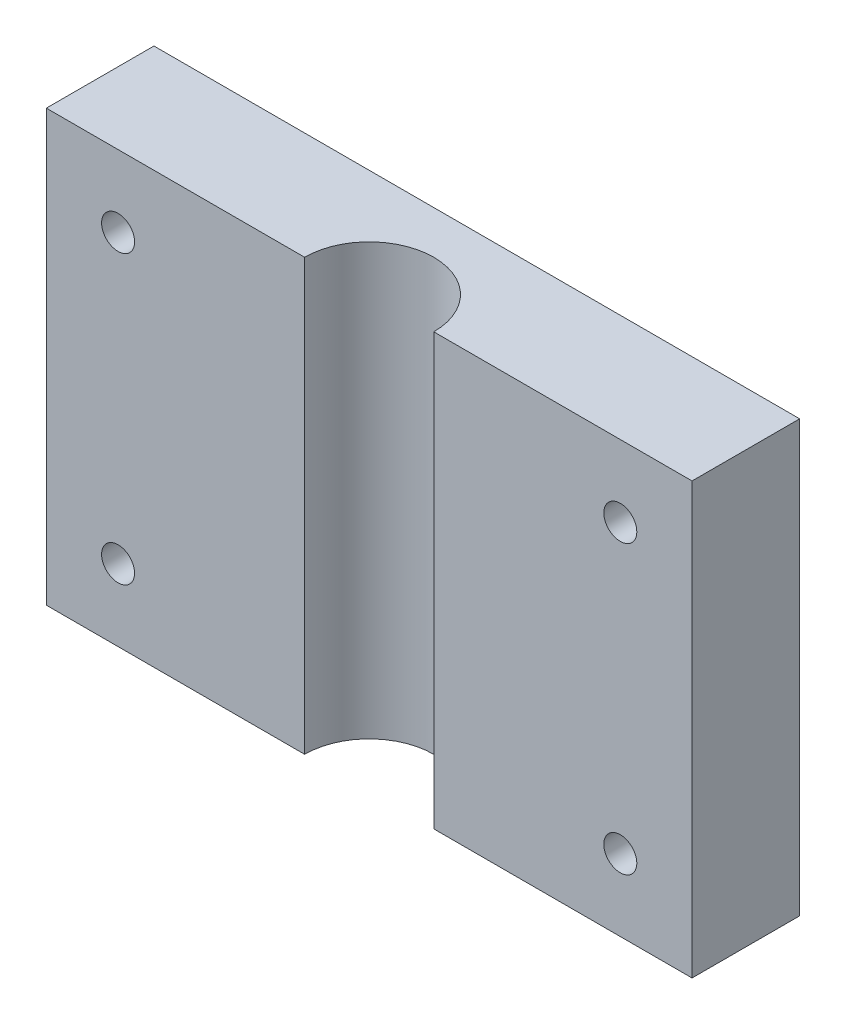
ISO-10303-21;
HEADER;
FILE_DESCRIPTION(('STEP AP214'),'2;1');
FILE_NAME('part.step','',(''),(''),'','','');
FILE_SCHEMA(('AUTOMOTIVE_DESIGN { 1 0 10303 214 1 1 1 1 }'));
ENDSEC;
DATA;
#1=APPLICATION_CONTEXT('core data for automotive mechanical design processes');
#2=APPLICATION_PROTOCOL_DEFINITION('international standard','automotive_design',2000,#1);
#3=PRODUCT_CONTEXT('',#1,'mechanical');
#4=PRODUCT('Part','Part','',(#3));
#5=PRODUCT_RELATED_PRODUCT_CATEGORY('part','',(#4));
#6=PRODUCT_DEFINITION_FORMATION('','',#4);
#7=PRODUCT_DEFINITION_CONTEXT('part definition',#1,'design');
#8=PRODUCT_DEFINITION('design','',#6,#7);
#9=PRODUCT_DEFINITION_SHAPE('','',#8);
#10=(LENGTH_UNIT() NAMED_UNIT(*) SI_UNIT(.MILLI.,.METRE.));
#11=(NAMED_UNIT(*) PLANE_ANGLE_UNIT() SI_UNIT($,.RADIAN.));
#12=(NAMED_UNIT(*) SI_UNIT($,.STERADIAN.) SOLID_ANGLE_UNIT());
#13=UNCERTAINTY_MEASURE_WITH_UNIT(LENGTH_MEASURE(1.E-05),#10,'distance_accuracy_value','');
#14=(GEOMETRIC_REPRESENTATION_CONTEXT(3) GLOBAL_UNCERTAINTY_ASSIGNED_CONTEXT((#13)) GLOBAL_UNIT_ASSIGNED_CONTEXT((#10,
#11,#12)) REPRESENTATION_CONTEXT('',''));
#15=CARTESIAN_POINT('',(0.,0.,0.));
#16=DIRECTION('',(0.,0.,1.));
#17=DIRECTION('',(1.,0.,0.));
#18=AXIS2_PLACEMENT_3D('',#15,#16,#17);
#19=CARTESIAN_POINT('',(0.,0.,15.));
#20=DIRECTION('',(0.,0.,1.));
#21=DIRECTION('',(1.,0.,0.));
#22=AXIS2_PLACEMENT_3D('',#19,#20,#21);
#23=PLANE('',#22);
#24=DIRECTION('',(0.,-1.,0.));
#25=VECTOR('',#24,1.);
#26=CARTESIAN_POINT('',(-8.99999999999999,42.,15.));
#27=LINE('',#26,#25);
#28=CARTESIAN_POINT('',(-8.99999999999998,30.,15.));
#29=VERTEX_POINT('',#28);
#30=CARTESIAN_POINT('',(-8.99999999999999,-30.,15.));
#31=VERTEX_POINT('',#30);
#32=EDGE_CURVE('E102',#29,#31,#27,.T.);
#33=ORIENTED_EDGE('',*,*,#32,.F.);
#34=DIRECTION('',(-1.,0.,0.));
#35=VECTOR('',#34,1.);
#36=CARTESIAN_POINT('',(-45.,30.,15.));
#37=LINE('',#36,#35);
#38=CARTESIAN_POINT('',(-45.,30.,15.));
#39=VERTEX_POINT('',#38);
#40=EDGE_CURVE('E147',#29,#39,#37,.T.);
#41=ORIENTED_EDGE('',*,*,#40,.T.);
#42=DIRECTION('',(0.,-1.,0.));
#43=VECTOR('',#42,1.);
#44=CARTESIAN_POINT('',(-45.,30.,15.));
#45=LINE('',#44,#43);
#46=CARTESIAN_POINT('',(-45.,-30.,15.));
#47=VERTEX_POINT('',#46);
#48=EDGE_CURVE('E113',#39,#47,#45,.T.);
#49=ORIENTED_EDGE('',*,*,#48,.T.);
#50=DIRECTION('',(1.,0.,0.));
#51=VECTOR('',#50,1.);
#52=CARTESIAN_POINT('',(-45.,-30.,15.));
#53=LINE('',#52,#51);
#54=EDGE_CURVE('E111',#47,#31,#53,.T.);
#55=ORIENTED_EDGE('',*,*,#54,.T.);
#56=EDGE_LOOP('',(#33,#41,#49,#55));
#57=FACE_BOUND('',#56,.T.);
#58=CARTESIAN_POINT('',(-35.,20.,15.));
#59=DIRECTION('',(0.,0.,1.));
#60=DIRECTION('',(-1.,0.,0.));
#61=AXIS2_PLACEMENT_3D('',#58,#59,#60);
#62=CIRCLE('',#61,2.3);
#63=CARTESIAN_POINT('',(-37.3,20.,15.));
#64=VERTEX_POINT('',#63);
#65=EDGE_CURVE('E169',#64,#64,#62,.T.);
#66=ORIENTED_EDGE('',*,*,#65,.F.);
#67=EDGE_LOOP('',(#66));
#68=FACE_BOUND('',#67,.T.);
#69=CARTESIAN_POINT('',(-35.,-20.,15.));
#70=DIRECTION('',(0.,0.,1.));
#71=DIRECTION('',(1.,0.,0.));
#72=AXIS2_PLACEMENT_3D('',#69,#70,#71);
#73=CIRCLE('',#72,2.3);
#74=CARTESIAN_POINT('',(-32.7,-20.,15.));
#75=VERTEX_POINT('',#74);
#76=EDGE_CURVE('E124',#75,#75,#73,.T.);
#77=ORIENTED_EDGE('',*,*,#76,.F.);
#78=EDGE_LOOP('',(#77));
#79=FACE_BOUND('',#78,.T.);
#80=ADVANCED_FACE('F41',(#57,#68,#79),#23,.T.);
#81=CARTESIAN_POINT('',(-45.,-30.,15.));
#82=DIRECTION('',(0.,1.,0.));
#83=DIRECTION('',(0.,0.,1.));
#84=AXIS2_PLACEMENT_3D('',#81,#82,#83);
#85=PLANE('',#84);
#86=CARTESIAN_POINT('',(0.,-30.,15.));
#87=DIRECTION('',(0.,-1.,0.));
#88=DIRECTION('',(0.,0.,-1.));
#89=AXIS2_PLACEMENT_3D('',#86,#87,#88);
#90=CIRCLE('',#89,9.);
#91=CARTESIAN_POINT('',(9.00000000000001,-30.,15.));
#92=VERTEX_POINT('',#91);
#93=EDGE_CURVE('E11',#31,#92,#90,.T.);
#94=ORIENTED_EDGE('',*,*,#93,.F.);
#95=ORIENTED_EDGE('',*,*,#54,.F.);
#96=DIRECTION('',(0.,0.,-1.));
#97=VECTOR('',#96,1.);
#98=CARTESIAN_POINT('',(-45.,-30.,15.));
#99=LINE('',#98,#97);
#100=CARTESIAN_POINT('',(-45.,-30.,0.));
#101=VERTEX_POINT('',#100);
#102=EDGE_CURVE('E133',#47,#101,#99,.T.);
#103=ORIENTED_EDGE('',*,*,#102,.T.);
#104=DIRECTION('',(1.,0.,0.));
#105=VECTOR('',#104,1.);
#106=CARTESIAN_POINT('',(-45.,-30.,0.));
#107=LINE('',#106,#105);
#108=CARTESIAN_POINT('',(45.,-30.,0.));
#109=VERTEX_POINT('',#108);
#110=EDGE_CURVE('E88',#101,#109,#107,.T.);
#111=ORIENTED_EDGE('',*,*,#110,.T.);
#112=DIRECTION('',(0.,0.,-1.));
#113=VECTOR('',#112,1.);
#114=CARTESIAN_POINT('',(45.,-30.,15.));
#115=LINE('',#114,#113);
#116=CARTESIAN_POINT('',(45.,-30.,15.));
#117=VERTEX_POINT('',#116);
#118=EDGE_CURVE('E115',#117,#109,#115,.T.);
#119=ORIENTED_EDGE('',*,*,#118,.F.);
#120=EDGE_CURVE('E65',#92,#117,#53,.T.);
#121=ORIENTED_EDGE('',*,*,#120,.F.);
#122=EDGE_LOOP('',(#94,#95,#103,#111,#119,#121));
#123=FACE_BOUND('',#122,.T.);
#124=ADVANCED_FACE('F112',(#123),#85,.F.);
#125=DIRECTION('',(0.,-1.,0.));
#126=VECTOR('',#125,1.);
#127=CARTESIAN_POINT('',(9.00000000000001,42.,15.));
#128=LINE('',#127,#126);
#129=CARTESIAN_POINT('',(9.00000000000001,30.,15.));
#130=VERTEX_POINT('',#129);
#131=EDGE_CURVE('E57',#92,#130,#128,.F.);
#132=ORIENTED_EDGE('',*,*,#131,.F.);
#133=ORIENTED_EDGE('',*,*,#120,.T.);
#134=DIRECTION('',(0.,1.,0.));
#135=VECTOR('',#134,1.);
#136=CARTESIAN_POINT('',(45.,30.,15.));
#137=LINE('',#136,#135);
#138=CARTESIAN_POINT('',(45.,30.,15.));
#139=VERTEX_POINT('',#138);
#140=EDGE_CURVE('E129',#117,#139,#137,.T.);
#141=ORIENTED_EDGE('',*,*,#140,.T.);
#142=EDGE_CURVE('E91',#139,#130,#37,.T.);
#143=ORIENTED_EDGE('',*,*,#142,.T.);
#144=EDGE_LOOP('',(#132,#133,#141,#143));
#145=FACE_BOUND('',#144,.T.);
#146=CARTESIAN_POINT('',(35.,20.,15.));
#147=DIRECTION('',(0.,0.,1.));
#148=DIRECTION('',(1.,0.,0.));
#149=AXIS2_PLACEMENT_3D('',#146,#147,#148);
#150=CIRCLE('',#149,2.3);
#151=CARTESIAN_POINT('',(37.3,20.,15.));
#152=VERTEX_POINT('',#151);
#153=EDGE_CURVE('E165',#152,#152,#150,.T.);
#154=ORIENTED_EDGE('',*,*,#153,.F.);
#155=EDGE_LOOP('',(#154));
#156=FACE_BOUND('',#155,.T.);
#157=CARTESIAN_POINT('',(35.,-20.,15.));
#158=DIRECTION('',(0.,0.,1.));
#159=DIRECTION('',(-1.,0.,0.));
#160=AXIS2_PLACEMENT_3D('',#157,#158,#159);
#161=CIRCLE('',#160,2.3);
#162=CARTESIAN_POINT('',(32.7,-20.,15.));
#163=VERTEX_POINT('',#162);
#164=EDGE_CURVE('E156',#163,#163,#161,.T.);
#165=ORIENTED_EDGE('',*,*,#164,.F.);
#166=EDGE_LOOP('',(#165));
#167=FACE_BOUND('',#166,.T.);
#168=ADVANCED_FACE('F110',(#145,#156,#167),#23,.T.);
#169=CARTESIAN_POINT('',(0.,0.,0.));
#170=DIRECTION('',(0.,0.,1.));
#171=DIRECTION('',(1.,0.,0.));
#172=AXIS2_PLACEMENT_3D('',#169,#170,#171);
#173=PLANE('',#172);
#174=DIRECTION('',(0.,1.,0.));
#175=VECTOR('',#174,1.);
#176=CARTESIAN_POINT('',(45.,30.,0.));
#177=LINE('',#176,#175);
#178=CARTESIAN_POINT('',(45.,30.,0.));
#179=VERTEX_POINT('',#178);
#180=EDGE_CURVE('E116',#109,#179,#177,.T.);
#181=ORIENTED_EDGE('',*,*,#180,.F.);
#182=ORIENTED_EDGE('',*,*,#110,.F.);
#183=DIRECTION('',(0.,-1.,0.));
#184=VECTOR('',#183,1.);
#185=CARTESIAN_POINT('',(-45.,30.,0.));
#186=LINE('',#185,#184);
#187=CARTESIAN_POINT('',(-45.,30.,0.));
#188=VERTEX_POINT('',#187);
#189=EDGE_CURVE('E127',#188,#101,#186,.T.);
#190=ORIENTED_EDGE('',*,*,#189,.F.);
#191=DIRECTION('',(-1.,0.,0.));
#192=VECTOR('',#191,1.);
#193=CARTESIAN_POINT('',(-45.,30.,0.));
#194=LINE('',#193,#192);
#195=EDGE_CURVE('E123',#179,#188,#194,.T.);
#196=ORIENTED_EDGE('',*,*,#195,.F.);
#197=EDGE_LOOP('',(#181,#182,#190,#196));
#198=FACE_BOUND('',#197,.T.);
#199=CARTESIAN_POINT('',(-35.,-20.,0.));
#200=DIRECTION('',(0.,0.,1.));
#201=DIRECTION('',(1.,0.,0.));
#202=AXIS2_PLACEMENT_3D('',#199,#200,#201);
#203=CIRCLE('',#202,2.3);
#204=CARTESIAN_POINT('',(-32.7,-20.,0.));
#205=VERTEX_POINT('',#204);
#206=EDGE_CURVE('E153',#205,#205,#203,.T.);
#207=ORIENTED_EDGE('',*,*,#206,.T.);
#208=EDGE_LOOP('',(#207));
#209=FACE_BOUND('',#208,.T.);
#210=CARTESIAN_POINT('',(35.,-20.,0.));
#211=DIRECTION('',(0.,0.,1.));
#212=DIRECTION('',(-1.,0.,0.));
#213=AXIS2_PLACEMENT_3D('',#210,#211,#212);
#214=CIRCLE('',#213,2.3);
#215=CARTESIAN_POINT('',(32.7,-20.,0.));
#216=VERTEX_POINT('',#215);
#217=EDGE_CURVE('E157',#216,#216,#214,.T.);
#218=ORIENTED_EDGE('',*,*,#217,.T.);
#219=EDGE_LOOP('',(#218));
#220=FACE_BOUND('',#219,.T.);
#221=CARTESIAN_POINT('',(35.,20.,0.));
#222=DIRECTION('',(0.,0.,1.));
#223=DIRECTION('',(1.,0.,0.));
#224=AXIS2_PLACEMENT_3D('',#221,#222,#223);
#225=CIRCLE('',#224,2.3);
#226=CARTESIAN_POINT('',(37.3,20.,0.));
#227=VERTEX_POINT('',#226);
#228=EDGE_CURVE('E164',#227,#227,#225,.T.);
#229=ORIENTED_EDGE('',*,*,#228,.T.);
#230=EDGE_LOOP('',(#229));
#231=FACE_BOUND('',#230,.T.);
#232=CARTESIAN_POINT('',(-35.,20.,0.));
#233=DIRECTION('',(0.,0.,1.));
#234=DIRECTION('',(-1.,0.,0.));
#235=AXIS2_PLACEMENT_3D('',#232,#233,#234);
#236=CIRCLE('',#235,2.3);
#237=CARTESIAN_POINT('',(-37.3,20.,0.));
#238=VERTEX_POINT('',#237);
#239=EDGE_CURVE('E173',#238,#238,#236,.T.);
#240=ORIENTED_EDGE('',*,*,#239,.T.);
#241=EDGE_LOOP('',(#240));
#242=FACE_BOUND('',#241,.T.);
#243=ADVANCED_FACE('F145',(#198,#209,#220,#231,#242),#173,.F.);
#244=CARTESIAN_POINT('',(45.,30.,15.));
#245=DIRECTION('',(-1.,0.,0.));
#246=DIRECTION('',(0.,-1.,0.));
#247=AXIS2_PLACEMENT_3D('',#244,#245,#246);
#248=PLANE('',#247);
#249=ORIENTED_EDGE('',*,*,#180,.T.);
#250=DIRECTION('',(0.,0.,-1.));
#251=VECTOR('',#250,1.);
#252=CARTESIAN_POINT('',(45.,30.,15.));
#253=LINE('',#252,#251);
#254=EDGE_CURVE('E44',#139,#179,#253,.T.);
#255=ORIENTED_EDGE('',*,*,#254,.F.);
#256=ORIENTED_EDGE('',*,*,#140,.F.);
#257=ORIENTED_EDGE('',*,*,#118,.T.);
#258=EDGE_LOOP('',(#249,#255,#256,#257));
#259=FACE_BOUND('',#258,.T.);
#260=ADVANCED_FACE('F43',(#259),#248,.F.);
#261=CARTESIAN_POINT('',(-45.,30.,15.));
#262=DIRECTION('',(0.,-1.,0.));
#263=DIRECTION('',(0.,0.,-1.));
#264=AXIS2_PLACEMENT_3D('',#261,#262,#263);
#265=PLANE('',#264);
#266=ORIENTED_EDGE('',*,*,#40,.F.);
#267=CARTESIAN_POINT('',(0.,30.,15.));
#268=DIRECTION('',(0.,-1.,0.));
#269=DIRECTION('',(0.,0.,-1.));
#270=AXIS2_PLACEMENT_3D('',#267,#268,#269);
#271=CIRCLE('',#270,9.);
#272=EDGE_CURVE('E108',#29,#130,#271,.T.);
#273=ORIENTED_EDGE('',*,*,#272,.T.);
#274=ORIENTED_EDGE('',*,*,#142,.F.);
#275=ORIENTED_EDGE('',*,*,#254,.T.);
#276=ORIENTED_EDGE('',*,*,#195,.T.);
#277=DIRECTION('',(0.,0.,-1.));
#278=VECTOR('',#277,1.);
#279=CARTESIAN_POINT('',(-45.,30.,15.));
#280=LINE('',#279,#278);
#281=EDGE_CURVE('E134',#39,#188,#280,.T.);
#282=ORIENTED_EDGE('',*,*,#281,.F.);
#283=EDGE_LOOP('',(#266,#273,#274,#275,#276,#282));
#284=FACE_BOUND('',#283,.T.);
#285=ADVANCED_FACE('F136',(#284),#265,.F.);
#286=CARTESIAN_POINT('',(-45.,30.,15.));
#287=DIRECTION('',(1.,0.,0.));
#288=DIRECTION('',(0.,1.,0.));
#289=AXIS2_PLACEMENT_3D('',#286,#287,#288);
#290=PLANE('',#289);
#291=ORIENTED_EDGE('',*,*,#189,.T.);
#292=ORIENTED_EDGE('',*,*,#102,.F.);
#293=ORIENTED_EDGE('',*,*,#48,.F.);
#294=ORIENTED_EDGE('',*,*,#281,.T.);
#295=EDGE_LOOP('',(#291,#292,#293,#294));
#296=FACE_BOUND('',#295,.T.);
#297=ADVANCED_FACE('F150',(#296),#290,.F.);
#298=CARTESIAN_POINT('',(-35.,-20.,15.));
#299=DIRECTION('',(0.,0.,-1.));
#300=DIRECTION('',(-1.,0.,0.));
#301=AXIS2_PLACEMENT_3D('',#298,#299,#300);
#302=CYLINDRICAL_SURFACE('',#301,2.3);
#303=ORIENTED_EDGE('',*,*,#76,.T.);
#304=EDGE_LOOP('',(#303));
#305=FACE_BOUND('',#304,.T.);
#306=ORIENTED_EDGE('',*,*,#206,.F.);
#307=EDGE_LOOP('',(#306));
#308=FACE_BOUND('',#307,.T.);
#309=ADVANCED_FACE('F188',(#305,#308),#302,.F.);
#310=CARTESIAN_POINT('',(35.,-20.,15.));
#311=DIRECTION('',(0.,0.,-1.));
#312=DIRECTION('',(-1.,0.,0.));
#313=AXIS2_PLACEMENT_3D('',#310,#311,#312);
#314=CYLINDRICAL_SURFACE('',#313,2.3);
#315=ORIENTED_EDGE('',*,*,#164,.T.);
#316=EDGE_LOOP('',(#315));
#317=FACE_BOUND('',#316,.T.);
#318=ORIENTED_EDGE('',*,*,#217,.F.);
#319=EDGE_LOOP('',(#318));
#320=FACE_BOUND('',#319,.T.);
#321=ADVANCED_FACE('F190',(#317,#320),#314,.F.);
#322=CARTESIAN_POINT('',(35.,20.,15.));
#323=DIRECTION('',(0.,0.,-1.));
#324=DIRECTION('',(-1.,0.,0.));
#325=AXIS2_PLACEMENT_3D('',#322,#323,#324);
#326=CYLINDRICAL_SURFACE('',#325,2.3);
#327=ORIENTED_EDGE('',*,*,#153,.T.);
#328=EDGE_LOOP('',(#327));
#329=FACE_BOUND('',#328,.T.);
#330=ORIENTED_EDGE('',*,*,#228,.F.);
#331=EDGE_LOOP('',(#330));
#332=FACE_BOUND('',#331,.T.);
#333=ADVANCED_FACE('F203',(#329,#332),#326,.F.);
#334=CARTESIAN_POINT('',(-35.,20.,15.));
#335=DIRECTION('',(0.,0.,-1.));
#336=DIRECTION('',(-1.,0.,0.));
#337=AXIS2_PLACEMENT_3D('',#334,#335,#336);
#338=CYLINDRICAL_SURFACE('',#337,2.3);
#339=ORIENTED_EDGE('',*,*,#65,.T.);
#340=EDGE_LOOP('',(#339));
#341=FACE_BOUND('',#340,.T.);
#342=ORIENTED_EDGE('',*,*,#239,.F.);
#343=EDGE_LOOP('',(#342));
#344=FACE_BOUND('',#343,.T.);
#345=ADVANCED_FACE('F179',(#341,#344),#338,.F.);
#346=CARTESIAN_POINT('',(0.,42.,15.));
#347=DIRECTION('',(0.,-1.,0.));
#348=DIRECTION('',(0.,0.,-1.));
#349=AXIS2_PLACEMENT_3D('',#346,#347,#348);
#350=CYLINDRICAL_SURFACE('',#349,9.);
#351=ORIENTED_EDGE('',*,*,#32,.T.);
#352=ORIENTED_EDGE('',*,*,#93,.T.);
#353=ORIENTED_EDGE('',*,*,#131,.T.);
#354=ORIENTED_EDGE('',*,*,#272,.F.);
#355=EDGE_LOOP('',(#351,#352,#353,#354));
#356=FACE_BOUND('',#355,.T.);
#357=ADVANCED_FACE('F105',(#356),#350,.F.);
#358=CLOSED_SHELL('',(#80,#124,#168,#243,#260,#285,#297,#309,#321,#333,#345,#357));
#359=MANIFOLD_SOLID_BREP('B2',#358);
#360=ADVANCED_BREP_SHAPE_REPRESENTATION('',(#18,#359),#14);
#361=SHAPE_DEFINITION_REPRESENTATION(#9,#360);
ENDSEC;
END-ISO-10303-21;
